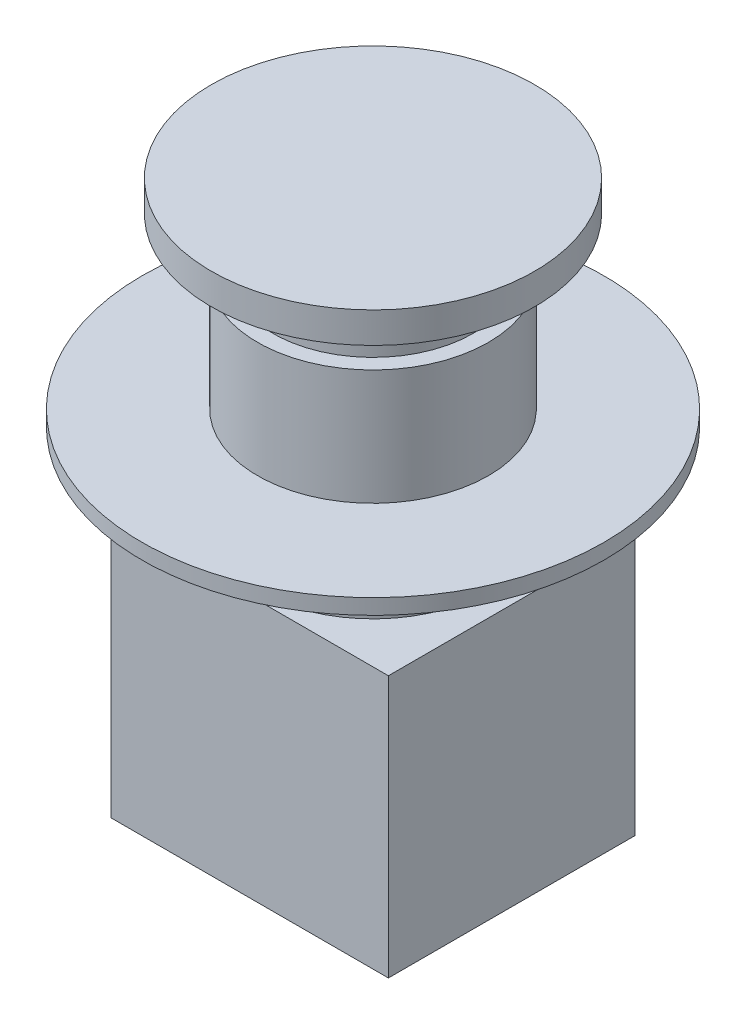
ISO-10303-21;
HEADER;
FILE_DESCRIPTION(('STEP AP214'),'2;1');
FILE_NAME('part.step','',(''),(''),'','','');
FILE_SCHEMA(('AUTOMOTIVE_DESIGN { 1 0 10303 214 1 1 1 1 }'));
ENDSEC;
DATA;
#1=APPLICATION_CONTEXT('core data for automotive mechanical design processes');
#2=APPLICATION_PROTOCOL_DEFINITION('international standard','automotive_design',2000,#1);
#3=PRODUCT_CONTEXT('',#1,'mechanical');
#4=PRODUCT('Part','Part','',(#3));
#5=PRODUCT_RELATED_PRODUCT_CATEGORY('part','',(#4));
#6=PRODUCT_DEFINITION_FORMATION('','',#4);
#7=PRODUCT_DEFINITION_CONTEXT('part definition',#1,'design');
#8=PRODUCT_DEFINITION('design','',#6,#7);
#9=PRODUCT_DEFINITION_SHAPE('','',#8);
#10=(LENGTH_UNIT() NAMED_UNIT(*) SI_UNIT(.MILLI.,.METRE.));
#11=(NAMED_UNIT(*) PLANE_ANGLE_UNIT() SI_UNIT($,.RADIAN.));
#12=(NAMED_UNIT(*) SI_UNIT($,.STERADIAN.) SOLID_ANGLE_UNIT());
#13=UNCERTAINTY_MEASURE_WITH_UNIT(LENGTH_MEASURE(1.E-05),#10,'distance_accuracy_value','');
#14=(GEOMETRIC_REPRESENTATION_CONTEXT(3) GLOBAL_UNCERTAINTY_ASSIGNED_CONTEXT((#13)) GLOBAL_UNIT_ASSIGNED_CONTEXT((#10,
#11,#12)) REPRESENTATION_CONTEXT('',''));
#15=CARTESIAN_POINT('',(0.,0.,0.));
#16=DIRECTION('',(0.,0.,1.));
#17=DIRECTION('',(1.,0.,0.));
#18=AXIS2_PLACEMENT_3D('',#15,#16,#17);
#19=CARTESIAN_POINT('',(0.,0.,0.));
#20=DIRECTION('',(0.,1.,0.));
#21=DIRECTION('',(-1.,0.,0.));
#22=AXIS2_PLACEMENT_3D('',#19,#20,#21);
#23=PLANE('',#22);
#24=CARTESIAN_POINT('',(0.,0.,0.));
#25=DIRECTION('',(0.,1.,0.));
#26=DIRECTION('',(-1.,0.,0.));
#27=AXIS2_PLACEMENT_3D('',#24,#25,#26);
#28=CIRCLE('',#27,15.);
#29=CARTESIAN_POINT('',(-15.,0.,0.));
#30=VERTEX_POINT('',#29);
#31=EDGE_CURVE('E11',#30,#30,#28,.F.);
#32=ORIENTED_EDGE('',*,*,#31,.F.);
#33=EDGE_LOOP('',(#32));
#34=FACE_BOUND('',#33,.T.);
#35=CARTESIAN_POINT('',(0.,0.,0.));
#36=DIRECTION('',(0.,1.,0.));
#37=DIRECTION('',(-1.,0.,0.));
#38=AXIS2_PLACEMENT_3D('',#35,#36,#37);
#39=CIRCLE('',#38,30.);
#40=CARTESIAN_POINT('',(-30.,0.,0.));
#41=VERTEX_POINT('',#40);
#42=EDGE_CURVE('E40',#41,#41,#39,.T.);
#43=ORIENTED_EDGE('',*,*,#42,.F.);
#44=EDGE_LOOP('',(#43));
#45=FACE_BOUND('',#44,.T.);
#46=ADVANCED_FACE('F32',(#34,#45),#23,.F.);
#47=CARTESIAN_POINT('',(0.,28.,0.));
#48=DIRECTION('',(0.,1.,0.));
#49=DIRECTION('',(-1.,0.,0.));
#50=AXIS2_PLACEMENT_3D('',#47,#48,#49);
#51=CYLINDRICAL_SURFACE('',#50,30.);
#52=CARTESIAN_POINT('',(0.,2.00000000000001,0.));
#53=DIRECTION('',(0.,1.,0.));
#54=DIRECTION('',(-1.,0.,0.));
#55=AXIS2_PLACEMENT_3D('',#52,#53,#54);
#56=CIRCLE('',#55,30.);
#57=CARTESIAN_POINT('',(-30.,2.00000000000001,0.));
#58=VERTEX_POINT('',#57);
#59=EDGE_CURVE('E129',#58,#58,#56,.T.);
#60=ORIENTED_EDGE('',*,*,#59,.F.);
#61=EDGE_LOOP('',(#60));
#62=FACE_BOUND('',#61,.T.);
#63=ORIENTED_EDGE('',*,*,#42,.T.);
#64=EDGE_LOOP('',(#63));
#65=FACE_BOUND('',#64,.T.);
#66=ADVANCED_FACE('F134',(#62,#65),#51,.T.);
#67=CARTESIAN_POINT('',(30.,2.,0.));
#68=DIRECTION('',(0.,-1.,0.));
#69=DIRECTION('',(1.,0.,0.));
#70=AXIS2_PLACEMENT_3D('',#67,#68,#69);
#71=PLANE('',#70);
#72=CARTESIAN_POINT('',(0.,2.,0.));
#73=DIRECTION('',(0.,1.,0.));
#74=DIRECTION('',(-1.,0.,0.));
#75=AXIS2_PLACEMENT_3D('',#72,#73,#74);
#76=CIRCLE('',#75,15.);
#77=CARTESIAN_POINT('',(-15.,2.,0.));
#78=VERTEX_POINT('',#77);
#79=EDGE_CURVE('E126',#78,#78,#76,.T.);
#80=ORIENTED_EDGE('',*,*,#79,.F.);
#81=EDGE_LOOP('',(#80));
#82=FACE_BOUND('',#81,.T.);
#83=ORIENTED_EDGE('',*,*,#59,.T.);
#84=EDGE_LOOP('',(#83));
#85=FACE_BOUND('',#84,.T.);
#86=ADVANCED_FACE('F143',(#82,#85),#71,.F.);
#87=CARTESIAN_POINT('',(0.,28.,0.));
#88=DIRECTION('',(0.,1.,0.));
#89=DIRECTION('',(-1.,0.,0.));
#90=AXIS2_PLACEMENT_3D('',#87,#88,#89);
#91=CYLINDRICAL_SURFACE('',#90,15.);
#92=CARTESIAN_POINT('',(0.,17.,0.));
#93=DIRECTION('',(0.,1.,0.));
#94=DIRECTION('',(-1.,0.,0.));
#95=AXIS2_PLACEMENT_3D('',#92,#93,#94);
#96=CIRCLE('',#95,15.);
#97=CARTESIAN_POINT('',(-15.,17.,0.));
#98=VERTEX_POINT('',#97);
#99=EDGE_CURVE('E123',#98,#98,#96,.T.);
#100=ORIENTED_EDGE('',*,*,#99,.F.);
#101=EDGE_LOOP('',(#100));
#102=FACE_BOUND('',#101,.T.);
#103=ORIENTED_EDGE('',*,*,#79,.T.);
#104=EDGE_LOOP('',(#103));
#105=FACE_BOUND('',#104,.T.);
#106=ADVANCED_FACE('F178',(#102,#105),#91,.T.);
#107=CARTESIAN_POINT('',(15.,17.,0.));
#108=DIRECTION('',(0.,-1.,0.));
#109=DIRECTION('',(1.,0.,0.));
#110=AXIS2_PLACEMENT_3D('',#107,#108,#109);
#111=PLANE('',#110);
#112=CARTESIAN_POINT('',(0.,17.,0.));
#113=DIRECTION('',(0.,1.,0.));
#114=DIRECTION('',(-1.,0.,0.));
#115=AXIS2_PLACEMENT_3D('',#112,#113,#114);
#116=CIRCLE('',#115,13.);
#117=CARTESIAN_POINT('',(-13.,17.,0.));
#118=VERTEX_POINT('',#117);
#119=EDGE_CURVE('E120',#118,#118,#116,.T.);
#120=ORIENTED_EDGE('',*,*,#119,.F.);
#121=EDGE_LOOP('',(#120));
#122=FACE_BOUND('',#121,.T.);
#123=ORIENTED_EDGE('',*,*,#99,.T.);
#124=EDGE_LOOP('',(#123));
#125=FACE_BOUND('',#124,.T.);
#126=ADVANCED_FACE('F174',(#122,#125),#111,.F.);
#127=CARTESIAN_POINT('',(0.,28.,0.));
#128=DIRECTION('',(0.,1.,0.));
#129=DIRECTION('',(-1.,0.,0.));
#130=AXIS2_PLACEMENT_3D('',#127,#128,#129);
#131=CYLINDRICAL_SURFACE('',#130,13.);
#132=CARTESIAN_POINT('',(0.,24.,0.));
#133=DIRECTION('',(0.,1.,0.));
#134=DIRECTION('',(-1.,0.,0.));
#135=AXIS2_PLACEMENT_3D('',#132,#133,#134);
#136=CIRCLE('',#135,13.);
#137=CARTESIAN_POINT('',(-13.,24.,0.));
#138=VERTEX_POINT('',#137);
#139=EDGE_CURVE('E117',#138,#138,#136,.T.);
#140=ORIENTED_EDGE('',*,*,#139,.F.);
#141=EDGE_LOOP('',(#140));
#142=FACE_BOUND('',#141,.T.);
#143=ORIENTED_EDGE('',*,*,#119,.T.);
#144=EDGE_LOOP('',(#143));
#145=FACE_BOUND('',#144,.T.);
#146=ADVANCED_FACE('F170',(#142,#145),#131,.T.);
#147=CARTESIAN_POINT('',(13.,24.,0.));
#148=DIRECTION('',(0.,1.,0.));
#149=DIRECTION('',(-1.,0.,0.));
#150=AXIS2_PLACEMENT_3D('',#147,#148,#149);
#151=PLANE('',#150);
#152=CARTESIAN_POINT('',(0.,24.,0.));
#153=DIRECTION('',(0.,1.,0.));
#154=DIRECTION('',(-1.,0.,0.));
#155=AXIS2_PLACEMENT_3D('',#152,#153,#154);
#156=CIRCLE('',#155,21.);
#157=CARTESIAN_POINT('',(-21.,24.,0.));
#158=VERTEX_POINT('',#157);
#159=EDGE_CURVE('E114',#158,#158,#156,.T.);
#160=ORIENTED_EDGE('',*,*,#159,.F.);
#161=EDGE_LOOP('',(#160));
#162=FACE_BOUND('',#161,.T.);
#163=ORIENTED_EDGE('',*,*,#139,.T.);
#164=EDGE_LOOP('',(#163));
#165=FACE_BOUND('',#164,.T.);
#166=ADVANCED_FACE('F166',(#162,#165),#151,.F.);
#167=CARTESIAN_POINT('',(0.,28.,0.));
#168=DIRECTION('',(0.,1.,0.));
#169=DIRECTION('',(-1.,0.,0.));
#170=AXIS2_PLACEMENT_3D('',#167,#168,#169);
#171=CYLINDRICAL_SURFACE('',#170,21.);
#172=CARTESIAN_POINT('',(0.,28.,0.));
#173=DIRECTION('',(0.,1.,0.));
#174=DIRECTION('',(-1.,0.,0.));
#175=AXIS2_PLACEMENT_3D('',#172,#173,#174);
#176=CIRCLE('',#175,21.);
#177=CARTESIAN_POINT('',(-21.,28.,0.));
#178=VERTEX_POINT('',#177);
#179=EDGE_CURVE('E111',#178,#178,#176,.T.);
#180=ORIENTED_EDGE('',*,*,#179,.F.);
#181=EDGE_LOOP('',(#180));
#182=FACE_BOUND('',#181,.T.);
#183=ORIENTED_EDGE('',*,*,#159,.T.);
#184=EDGE_LOOP('',(#183));
#185=FACE_BOUND('',#184,.T.);
#186=ADVANCED_FACE('F158',(#182,#185),#171,.T.);
#187=CARTESIAN_POINT('',(21.,28.,0.));
#188=DIRECTION('',(0.,-1.,0.));
#189=DIRECTION('',(1.,0.,0.));
#190=AXIS2_PLACEMENT_3D('',#187,#188,#189);
#191=PLANE('',#190);
#192=ORIENTED_EDGE('',*,*,#179,.T.);
#193=EDGE_LOOP('',(#192));
#194=FACE_BOUND('',#193,.T.);
#195=ADVANCED_FACE('F150',(#194),#191,.F.);
#196=CARTESIAN_POINT('',(0.,-11.,0.));
#197=DIRECTION('',(0.,1.,0.));
#198=DIRECTION('',(-1.,0.,0.));
#199=AXIS2_PLACEMENT_3D('',#196,#197,#198);
#200=CYLINDRICAL_SURFACE('',#199,15.);
#201=CARTESIAN_POINT('',(0.,-11.,0.));
#202=DIRECTION('',(0.,-1.,0.));
#203=DIRECTION('',(1.,0.,0.));
#204=AXIS2_PLACEMENT_3D('',#201,#202,#203);
#205=CIRCLE('',#204,15.);
#206=CARTESIAN_POINT('',(15.,-11.,0.));
#207=VERTEX_POINT('',#206);
#208=EDGE_CURVE('E108',#207,#207,#205,.T.);
#209=ORIENTED_EDGE('',*,*,#208,.F.);
#210=EDGE_LOOP('',(#209));
#211=FACE_BOUND('',#210,.T.);
#212=ORIENTED_EDGE('',*,*,#31,.T.);
#213=EDGE_LOOP('',(#212));
#214=FACE_BOUND('',#213,.T.);
#215=ADVANCED_FACE('F147',(#211,#214),#200,.T.);
#216=CARTESIAN_POINT('',(18.,-45.,-16.));
#217=DIRECTION('',(-1.,0.,0.));
#218=DIRECTION('',(0.,0.,1.));
#219=AXIS2_PLACEMENT_3D('',#216,#217,#218);
#220=PLANE('',#219);
#221=DIRECTION('',(0.,0.,1.));
#222=VECTOR('',#221,1.);
#223=CARTESIAN_POINT('',(18.,-11.,-16.));
#224=LINE('',#223,#222);
#225=CARTESIAN_POINT('',(18.,-11.,-16.));
#226=VERTEX_POINT('',#225);
#227=CARTESIAN_POINT('',(18.,-11.,16.));
#228=VERTEX_POINT('',#227);
#229=EDGE_CURVE('E99',#226,#228,#224,.T.);
#230=ORIENTED_EDGE('',*,*,#229,.T.);
#231=DIRECTION('',(0.,1.,0.));
#232=VECTOR('',#231,1.);
#233=CARTESIAN_POINT('',(18.,-45.,16.));
#234=LINE('',#233,#232);
#235=CARTESIAN_POINT('',(18.,-45.,16.));
#236=VERTEX_POINT('',#235);
#237=EDGE_CURVE('E90',#236,#228,#234,.T.);
#238=ORIENTED_EDGE('',*,*,#237,.F.);
#239=DIRECTION('',(0.,0.,1.));
#240=VECTOR('',#239,1.);
#241=CARTESIAN_POINT('',(18.,-45.,-16.));
#242=LINE('',#241,#240);
#243=CARTESIAN_POINT('',(18.,-45.,-16.));
#244=VERTEX_POINT('',#243);
#245=EDGE_CURVE('E84',#244,#236,#242,.T.);
#246=ORIENTED_EDGE('',*,*,#245,.F.);
#247=DIRECTION('',(0.,1.,0.));
#248=VECTOR('',#247,1.);
#249=CARTESIAN_POINT('',(18.,-45.,-16.));
#250=LINE('',#249,#248);
#251=EDGE_CURVE('E95',#244,#226,#250,.T.);
#252=ORIENTED_EDGE('',*,*,#251,.T.);
#253=EDGE_LOOP('',(#230,#238,#246,#252));
#254=FACE_BOUND('',#253,.T.);
#255=ADVANCED_FACE('F149',(#254),#220,.F.);
#256=CARTESIAN_POINT('',(-18.,-45.,16.));
#257=DIRECTION('',(0.,0.,-1.));
#258=DIRECTION('',(-1.,0.,0.));
#259=AXIS2_PLACEMENT_3D('',#256,#257,#258);
#260=PLANE('',#259);
#261=DIRECTION('',(-1.,0.,0.));
#262=VECTOR('',#261,1.);
#263=CARTESIAN_POINT('',(-18.,-11.,16.));
#264=LINE('',#263,#262);
#265=CARTESIAN_POINT('',(-18.,-11.,16.));
#266=VERTEX_POINT('',#265);
#267=EDGE_CURVE('E89',#228,#266,#264,.T.);
#268=ORIENTED_EDGE('',*,*,#267,.T.);
#269=DIRECTION('',(0.,1.,0.));
#270=VECTOR('',#269,1.);
#271=CARTESIAN_POINT('',(-18.,-45.,16.));
#272=LINE('',#271,#270);
#273=CARTESIAN_POINT('',(-18.,-45.,16.));
#274=VERTEX_POINT('',#273);
#275=EDGE_CURVE('E87',#274,#266,#272,.T.);
#276=ORIENTED_EDGE('',*,*,#275,.F.);
#277=DIRECTION('',(-1.,0.,0.));
#278=VECTOR('',#277,1.);
#279=CARTESIAN_POINT('',(-18.,-45.,16.));
#280=LINE('',#279,#278);
#281=EDGE_CURVE('E79',#236,#274,#280,.T.);
#282=ORIENTED_EDGE('',*,*,#281,.F.);
#283=ORIENTED_EDGE('',*,*,#237,.T.);
#284=EDGE_LOOP('',(#268,#276,#282,#283));
#285=FACE_BOUND('',#284,.T.);
#286=ADVANCED_FACE('F88',(#285),#260,.F.);
#287=CARTESIAN_POINT('',(-18.,-45.,-16.));
#288=DIRECTION('',(1.,0.,0.));
#289=DIRECTION('',(0.,1.,0.));
#290=AXIS2_PLACEMENT_3D('',#287,#288,#289);
#291=PLANE('',#290);
#292=DIRECTION('',(0.,0.,-1.));
#293=VECTOR('',#292,1.);
#294=CARTESIAN_POINT('',(-18.,-11.,-16.));
#295=LINE('',#294,#293);
#296=CARTESIAN_POINT('',(-18.,-11.,-16.));
#297=VERTEX_POINT('',#296);
#298=EDGE_CURVE('E65',#266,#297,#295,.T.);
#299=ORIENTED_EDGE('',*,*,#298,.T.);
#300=DIRECTION('',(0.,1.,0.));
#301=VECTOR('',#300,1.);
#302=CARTESIAN_POINT('',(-18.,-45.,-16.));
#303=LINE('',#302,#301);
#304=CARTESIAN_POINT('',(-18.,-45.,-16.));
#305=VERTEX_POINT('',#304);
#306=EDGE_CURVE('E91',#305,#297,#303,.T.);
#307=ORIENTED_EDGE('',*,*,#306,.F.);
#308=DIRECTION('',(0.,0.,-1.));
#309=VECTOR('',#308,1.);
#310=CARTESIAN_POINT('',(-18.,-45.,-16.));
#311=LINE('',#310,#309);
#312=EDGE_CURVE('E82',#274,#305,#311,.T.);
#313=ORIENTED_EDGE('',*,*,#312,.F.);
#314=ORIENTED_EDGE('',*,*,#275,.T.);
#315=EDGE_LOOP('',(#299,#307,#313,#314));
#316=FACE_BOUND('',#315,.T.);
#317=ADVANCED_FACE('F93',(#316),#291,.F.);
#318=CARTESIAN_POINT('',(-18.,-45.,-16.));
#319=DIRECTION('',(0.,0.,1.));
#320=DIRECTION('',(1.,0.,0.));
#321=AXIS2_PLACEMENT_3D('',#318,#319,#320);
#322=PLANE('',#321);
#323=DIRECTION('',(1.,0.,0.));
#324=VECTOR('',#323,1.);
#325=CARTESIAN_POINT('',(-18.,-11.,-16.));
#326=LINE('',#325,#324);
#327=EDGE_CURVE('E71',#297,#226,#326,.T.);
#328=ORIENTED_EDGE('',*,*,#327,.T.);
#329=ORIENTED_EDGE('',*,*,#251,.F.);
#330=DIRECTION('',(1.,0.,0.));
#331=VECTOR('',#330,1.);
#332=CARTESIAN_POINT('',(-18.,-45.,-16.));
#333=LINE('',#332,#331);
#334=EDGE_CURVE('E48',#305,#244,#333,.T.);
#335=ORIENTED_EDGE('',*,*,#334,.F.);
#336=ORIENTED_EDGE('',*,*,#306,.T.);
#337=EDGE_LOOP('',(#328,#329,#335,#336));
#338=FACE_BOUND('',#337,.T.);
#339=ADVANCED_FACE('F243',(#338),#322,.F.);
#340=CARTESIAN_POINT('',(0.,-45.,0.));
#341=DIRECTION('',(0.,1.,0.));
#342=DIRECTION('',(-1.,0.,0.));
#343=AXIS2_PLACEMENT_3D('',#340,#341,#342);
#344=PLANE('',#343);
#345=ORIENTED_EDGE('',*,*,#245,.T.);
#346=ORIENTED_EDGE('',*,*,#281,.T.);
#347=ORIENTED_EDGE('',*,*,#312,.T.);
#348=ORIENTED_EDGE('',*,*,#334,.T.);
#349=EDGE_LOOP('',(#345,#346,#347,#348));
#350=FACE_BOUND('',#349,.T.);
#351=ADVANCED_FACE('F80',(#350),#344,.F.);
#352=CARTESIAN_POINT('',(0.,-11.,0.));
#353=DIRECTION('',(0.,1.,0.));
#354=DIRECTION('',(-1.,0.,0.));
#355=AXIS2_PLACEMENT_3D('',#352,#353,#354);
#356=PLANE('',#355);
#357=ORIENTED_EDGE('',*,*,#208,.T.);
#358=EDGE_LOOP('',(#357));
#359=FACE_BOUND('',#358,.T.);
#360=ORIENTED_EDGE('',*,*,#229,.F.);
#361=ORIENTED_EDGE('',*,*,#327,.F.);
#362=ORIENTED_EDGE('',*,*,#298,.F.);
#363=ORIENTED_EDGE('',*,*,#267,.F.);
#364=EDGE_LOOP('',(#360,#361,#362,#363));
#365=FACE_BOUND('',#364,.T.);
#366=ADVANCED_FACE('F258',(#359,#365),#356,.T.);
#367=CLOSED_SHELL('',(#46,#66,#86,#106,#126,#146,#166,#186,#195,#215,#255,#286,#317,#339,#351,#366));
#368=MANIFOLD_SOLID_BREP('B2',#367);
#369=ADVANCED_BREP_SHAPE_REPRESENTATION('',(#18,#368),#14);
#370=SHAPE_DEFINITION_REPRESENTATION(#9,#369);
ENDSEC;
END-ISO-10303-21;
